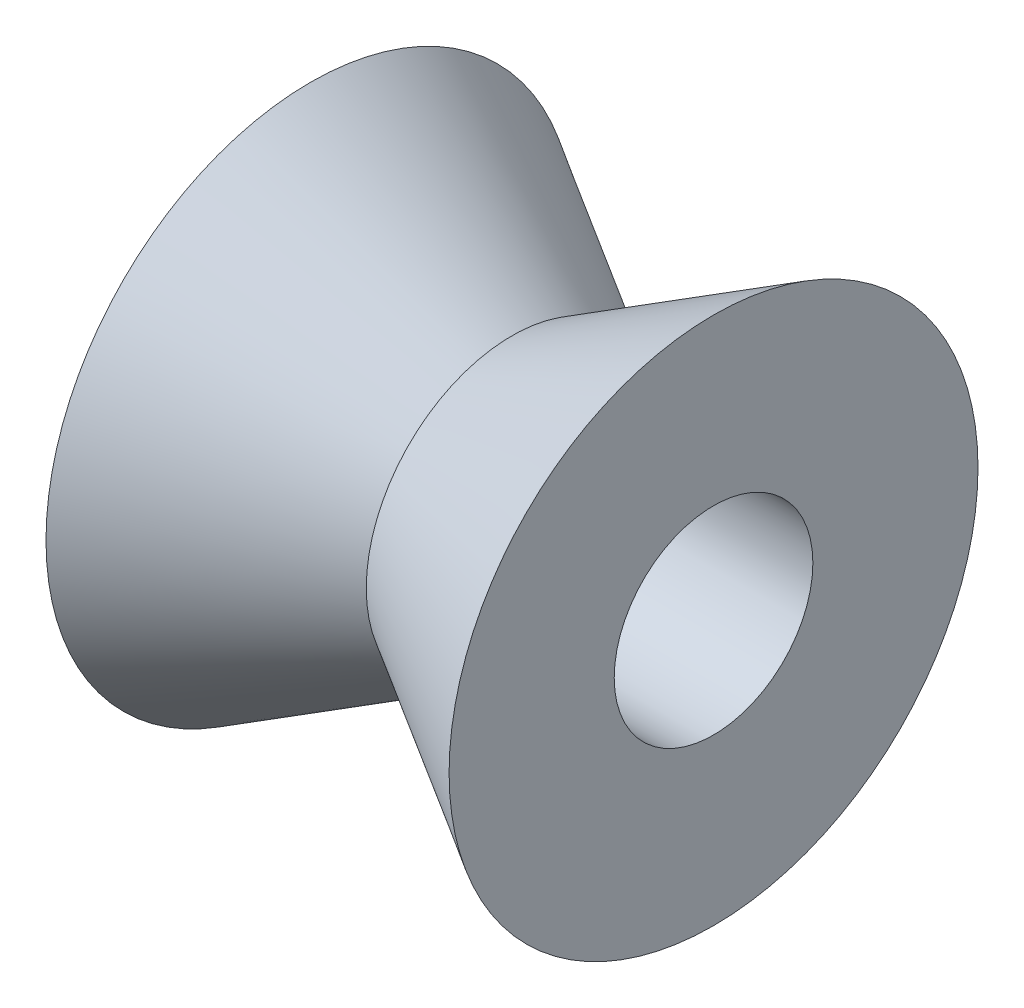
ISO-10303-21;
HEADER;
FILE_DESCRIPTION(('STEP AP214'),'2;1');
FILE_NAME('part.step','',(''),(''),'','','');
FILE_SCHEMA(('AUTOMOTIVE_DESIGN { 1 0 10303 214 1 1 1 1 }'));
ENDSEC;
DATA;
#1=APPLICATION_CONTEXT('core data for automotive mechanical design processes');
#2=APPLICATION_PROTOCOL_DEFINITION('international standard','automotive_design',2000,#1);
#3=PRODUCT_CONTEXT('',#1,'mechanical');
#4=PRODUCT('Part','Part','',(#3));
#5=PRODUCT_RELATED_PRODUCT_CATEGORY('part','',(#4));
#6=PRODUCT_DEFINITION_FORMATION('','',#4);
#7=PRODUCT_DEFINITION_CONTEXT('part definition',#1,'design');
#8=PRODUCT_DEFINITION('design','',#6,#7);
#9=PRODUCT_DEFINITION_SHAPE('','',#8);
#10=(LENGTH_UNIT() NAMED_UNIT(*) SI_UNIT(.MILLI.,.METRE.));
#11=(NAMED_UNIT(*) PLANE_ANGLE_UNIT() SI_UNIT($,.RADIAN.));
#12=(NAMED_UNIT(*) SI_UNIT($,.STERADIAN.) SOLID_ANGLE_UNIT());
#13=UNCERTAINTY_MEASURE_WITH_UNIT(LENGTH_MEASURE(1.E-05),#10,'distance_accuracy_value','');
#14=(GEOMETRIC_REPRESENTATION_CONTEXT(3) GLOBAL_UNCERTAINTY_ASSIGNED_CONTEXT((#13)) GLOBAL_UNIT_ASSIGNED_CONTEXT((#10,
#11,#12)) REPRESENTATION_CONTEXT('',''));
#15=CARTESIAN_POINT('',(0.,0.,0.));
#16=DIRECTION('',(0.,0.,1.));
#17=DIRECTION('',(1.,0.,0.));
#18=AXIS2_PLACEMENT_3D('',#15,#16,#17);
#19=CARTESIAN_POINT('',(-4.63991396053412,0.,0.));
#20=DIRECTION('',(-1.,0.,0.));
#21=DIRECTION('',(0.,0.,1.));
#22=AXIS2_PLACEMENT_3D('',#19,#20,#21);
#23=CONICAL_SURFACE('',#22,6.12339944392203,0.532292127442921);
#24=CARTESIAN_POINT('',(0.0267527061325462,0.,0.));
#25=DIRECTION('',(-1.,0.,0.));
#26=DIRECTION('',(0.,0.,1.));
#27=AXIS2_PLACEMENT_3D('',#24,#25,#26);
#28=CIRCLE('',#27,3.37473198118185);
#29=CARTESIAN_POINT('',(0.0267527061325462,0.,3.37473198118185));
#30=VERTEX_POINT('',#29);
#31=EDGE_CURVE('E54',#30,#30,#28,.T.);
#32=ORIENTED_EDGE('',*,*,#31,.T.);
#33=EDGE_LOOP('',(#32));
#34=FACE_BOUND('',#33,.T.);
#35=CARTESIAN_POINT('',(-4.63991396053412,0.,0.));
#36=DIRECTION('',(-1.,0.,0.));
#37=DIRECTION('',(0.,0.,1.));
#38=AXIS2_PLACEMENT_3D('',#35,#36,#37);
#39=CIRCLE('',#38,6.12339944392203);
#40=CARTESIAN_POINT('',(-4.63991396053412,0.,6.12339944392203));
#41=VERTEX_POINT('',#40);
#42=EDGE_CURVE('E10',#41,#41,#39,.T.);
#43=ORIENTED_EDGE('',*,*,#42,.F.);
#44=EDGE_LOOP('',(#43));
#45=FACE_BOUND('',#44,.T.);
#46=ADVANCED_FACE('F35',(#34,#45),#23,.T.);
#47=CARTESIAN_POINT('',(-4.63991396053412,0.,0.));
#48=DIRECTION('',(-1.,0.,0.));
#49=DIRECTION('',(0.,0.,1.));
#50=AXIS2_PLACEMENT_3D('',#47,#48,#49);
#51=PLANE('',#50);
#52=ORIENTED_EDGE('',*,*,#42,.T.);
#53=EDGE_LOOP('',(#52));
#54=FACE_BOUND('',#53,.T.);
#55=CARTESIAN_POINT('',(-4.63991396053412,0.,0.));
#56=DIRECTION('',(-1.,0.,0.));
#57=DIRECTION('',(0.,0.,1.));
#58=AXIS2_PLACEMENT_3D('',#55,#56,#57);
#59=CIRCLE('',#58,2.3);
#60=CARTESIAN_POINT('',(-4.63991396053412,0.,2.3));
#61=VERTEX_POINT('',#60);
#62=EDGE_CURVE('E41',#61,#61,#59,.T.);
#63=ORIENTED_EDGE('',*,*,#62,.F.);
#64=EDGE_LOOP('',(#63));
#65=FACE_BOUND('',#64,.T.);
#66=ADVANCED_FACE('F74',(#54,#65),#51,.T.);
#67=CARTESIAN_POINT('',(-4.63991396053412,0.,0.));
#68=DIRECTION('',(-1.,0.,0.));
#69=DIRECTION('',(0.,0.,1.));
#70=AXIS2_PLACEMENT_3D('',#67,#68,#69);
#71=CYLINDRICAL_SURFACE('',#70,2.3);
#72=CARTESIAN_POINT('',(4.69341937279921,0.,0.));
#73=DIRECTION('',(-1.,0.,0.));
#74=DIRECTION('',(0.,0.,1.));
#75=AXIS2_PLACEMENT_3D('',#72,#73,#74);
#76=CIRCLE('',#75,2.3);
#77=CARTESIAN_POINT('',(4.69341937279921,0.,2.3));
#78=VERTEX_POINT('',#77);
#79=EDGE_CURVE('E45',#78,#78,#76,.T.);
#80=ORIENTED_EDGE('',*,*,#79,.F.);
#81=EDGE_LOOP('',(#80));
#82=FACE_BOUND('',#81,.T.);
#83=ORIENTED_EDGE('',*,*,#62,.T.);
#84=EDGE_LOOP('',(#83));
#85=FACE_BOUND('',#84,.T.);
#86=ADVANCED_FACE('F69',(#82,#85),#71,.F.);
#87=CARTESIAN_POINT('',(4.69341937279921,0.,0.));
#88=DIRECTION('',(-1.,0.,0.));
#89=DIRECTION('',(0.,0.,1.));
#90=AXIS2_PLACEMENT_3D('',#87,#88,#89);
#91=PLANE('',#90);
#92=CARTESIAN_POINT('',(4.69341937279921,0.,0.));
#93=DIRECTION('',(-1.,0.,0.));
#94=DIRECTION('',(0.,0.,1.));
#95=AXIS2_PLACEMENT_3D('',#92,#93,#94);
#96=CIRCLE('',#95,6.12339944392203);
#97=CARTESIAN_POINT('',(4.69341937279921,0.,6.12339944392203));
#98=VERTEX_POINT('',#97);
#99=EDGE_CURVE('E49',#98,#98,#96,.T.);
#100=ORIENTED_EDGE('',*,*,#99,.F.);
#101=EDGE_LOOP('',(#100));
#102=FACE_BOUND('',#101,.T.);
#103=ORIENTED_EDGE('',*,*,#79,.T.);
#104=EDGE_LOOP('',(#103));
#105=FACE_BOUND('',#104,.T.);
#106=ADVANCED_FACE('F63',(#102,#105),#91,.F.);
#107=CARTESIAN_POINT('',(4.69341937279921,0.,0.));
#108=DIRECTION('',(1.,0.,0.));
#109=DIRECTION('',(0.,0.,-1.));
#110=AXIS2_PLACEMENT_3D('',#107,#108,#109);
#111=CONICAL_SURFACE('',#110,6.12339944392203,0.532292127442921);
#112=ORIENTED_EDGE('',*,*,#31,.F.);
#113=EDGE_LOOP('',(#112));
#114=FACE_BOUND('',#113,.T.);
#115=ORIENTED_EDGE('',*,*,#99,.T.);
#116=EDGE_LOOP('',(#115));
#117=FACE_BOUND('',#116,.T.);
#118=ADVANCED_FACE('F60',(#114,#117),#111,.T.);
#119=CLOSED_SHELL('',(#46,#66,#86,#106,#118));
#120=MANIFOLD_SOLID_BREP('B2',#119);
#121=ADVANCED_BREP_SHAPE_REPRESENTATION('',(#18,#120),#14);
#122=SHAPE_DEFINITION_REPRESENTATION(#9,#121);
ENDSEC;
END-ISO-10303-21;
